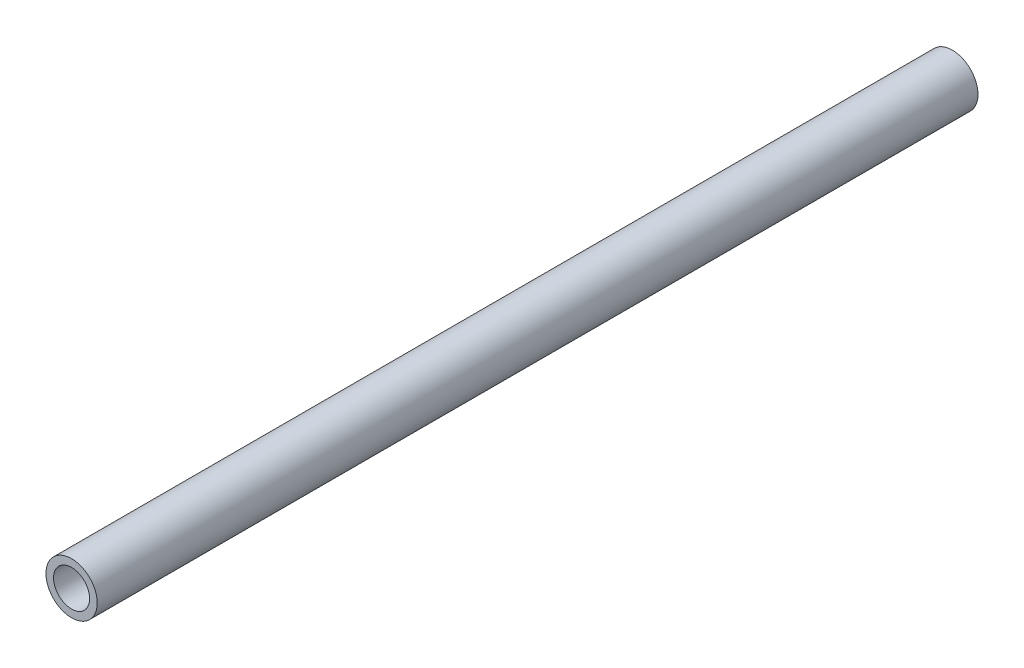
ISO-10303-21;
HEADER;
FILE_DESCRIPTION(('STEP AP214'),'2;1');
FILE_NAME('part.step','',(''),(''),'','','');
FILE_SCHEMA(('AUTOMOTIVE_DESIGN { 1 0 10303 214 1 1 1 1 }'));
ENDSEC;
DATA;
#1=APPLICATION_CONTEXT('core data for automotive mechanical design processes');
#2=APPLICATION_PROTOCOL_DEFINITION('international standard','automotive_design',2000,#1);
#3=PRODUCT_CONTEXT('',#1,'mechanical');
#4=PRODUCT('Part','Part','',(#3));
#5=PRODUCT_RELATED_PRODUCT_CATEGORY('part','',(#4));
#6=PRODUCT_DEFINITION_FORMATION('','',#4);
#7=PRODUCT_DEFINITION_CONTEXT('part definition',#1,'design');
#8=PRODUCT_DEFINITION('design','',#6,#7);
#9=PRODUCT_DEFINITION_SHAPE('','',#8);
#10=(LENGTH_UNIT() NAMED_UNIT(*) SI_UNIT(.MILLI.,.METRE.));
#11=(NAMED_UNIT(*) PLANE_ANGLE_UNIT() SI_UNIT($,.RADIAN.));
#12=(NAMED_UNIT(*) SI_UNIT($,.STERADIAN.) SOLID_ANGLE_UNIT());
#13=UNCERTAINTY_MEASURE_WITH_UNIT(LENGTH_MEASURE(1.E-05),#10,'distance_accuracy_value','');
#14=(GEOMETRIC_REPRESENTATION_CONTEXT(3) GLOBAL_UNCERTAINTY_ASSIGNED_CONTEXT((#13)) GLOBAL_UNIT_ASSIGNED_CONTEXT((#10,
#11,#12)) REPRESENTATION_CONTEXT('',''));
#15=CARTESIAN_POINT('',(0.,0.,0.));
#16=DIRECTION('',(0.,0.,1.));
#17=DIRECTION('',(1.,0.,0.));
#18=AXIS2_PLACEMENT_3D('',#15,#16,#17);
#19=CARTESIAN_POINT('',(351.5,-19.,502.183766184074));
#20=DIRECTION('',(0.,0.,-1.));
#21=DIRECTION('',(-1.,0.,0.));
#22=AXIS2_PLACEMENT_3D('',#19,#20,#21);
#23=CYLINDRICAL_SURFACE('',#22,13.5);
#24=CARTESIAN_POINT('',(351.5,-19.,0.));
#25=DIRECTION('',(0.,0.,1.));
#26=DIRECTION('',(1.,0.,0.));
#27=AXIS2_PLACEMENT_3D('',#24,#25,#26);
#28=CIRCLE('',#27,13.5);
#29=CARTESIAN_POINT('',(365.,-19.,0.));
#30=VERTEX_POINT('',#29);
#31=EDGE_CURVE('E47',#30,#30,#28,.T.);
#32=ORIENTED_EDGE('',*,*,#31,.T.);
#33=EDGE_LOOP('',(#32));
#34=FACE_BOUND('',#33,.T.);
#35=CARTESIAN_POINT('',(351.5,-19.,464.));
#36=DIRECTION('',(0.,0.,1.));
#37=DIRECTION('',(1.,0.,0.));
#38=AXIS2_PLACEMENT_3D('',#35,#36,#37);
#39=CIRCLE('',#38,13.5);
#40=CARTESIAN_POINT('',(365.,-19.,464.));
#41=VERTEX_POINT('',#40);
#42=EDGE_CURVE('E10',#41,#41,#39,.T.);
#43=ORIENTED_EDGE('',*,*,#42,.F.);
#44=EDGE_LOOP('',(#43));
#45=FACE_BOUND('',#44,.T.);
#46=ADVANCED_FACE('F34',(#34,#45),#23,.T.);
#47=CARTESIAN_POINT('',(351.5,-19.,0.));
#48=DIRECTION('',(0.,0.,1.));
#49=DIRECTION('',(1.,0.,0.));
#50=AXIS2_PLACEMENT_3D('',#47,#48,#49);
#51=PLANE('',#50);
#52=ORIENTED_EDGE('',*,*,#31,.F.);
#53=EDGE_LOOP('',(#52));
#54=FACE_BOUND('',#53,.T.);
#55=CARTESIAN_POINT('',(351.5,-19.,0.));
#56=DIRECTION('',(0.,0.,1.));
#57=DIRECTION('',(1.,0.,0.));
#58=AXIS2_PLACEMENT_3D('',#55,#56,#57);
#59=CIRCLE('',#58,9.50000000000001);
#60=CARTESIAN_POINT('',(361.,-19.,0.));
#61=VERTEX_POINT('',#60);
#62=EDGE_CURVE('E49',#61,#61,#59,.T.);
#63=ORIENTED_EDGE('',*,*,#62,.T.);
#64=EDGE_LOOP('',(#63));
#65=FACE_BOUND('',#64,.T.);
#66=ADVANCED_FACE('F58',(#54,#65),#51,.F.);
#67=CARTESIAN_POINT('',(351.5,-19.,502.183766184074));
#68=DIRECTION('',(0.,0.,-1.));
#69=DIRECTION('',(-1.,0.,0.));
#70=AXIS2_PLACEMENT_3D('',#67,#68,#69);
#71=CYLINDRICAL_SURFACE('',#70,9.50000000000001);
#72=ORIENTED_EDGE('',*,*,#62,.F.);
#73=EDGE_LOOP('',(#72));
#74=FACE_BOUND('',#73,.T.);
#75=CARTESIAN_POINT('',(351.5,-19.,464.));
#76=DIRECTION('',(0.,0.,1.));
#77=DIRECTION('',(1.,0.,0.));
#78=AXIS2_PLACEMENT_3D('',#75,#76,#77);
#79=CIRCLE('',#78,9.50000000000001);
#80=CARTESIAN_POINT('',(361.,-19.,464.));
#81=VERTEX_POINT('',#80);
#82=EDGE_CURVE('E37',#81,#81,#79,.T.);
#83=ORIENTED_EDGE('',*,*,#82,.T.);
#84=EDGE_LOOP('',(#83));
#85=FACE_BOUND('',#84,.T.);
#86=ADVANCED_FACE('F61',(#74,#85),#71,.F.);
#87=CARTESIAN_POINT('',(0.,-38.,464.));
#88=DIRECTION('',(0.,0.,1.));
#89=DIRECTION('',(-1.,0.,0.));
#90=AXIS2_PLACEMENT_3D('',#87,#88,#89);
#91=PLANE('',#90);
#92=ORIENTED_EDGE('',*,*,#82,.F.);
#93=EDGE_LOOP('',(#92));
#94=FACE_BOUND('',#93,.T.);
#95=ORIENTED_EDGE('',*,*,#42,.T.);
#96=EDGE_LOOP('',(#95));
#97=FACE_BOUND('',#96,.T.);
#98=ADVANCED_FACE('F66',(#94,#97),#91,.T.);
#99=CLOSED_SHELL('',(#46,#66,#86,#98));
#100=MANIFOLD_SOLID_BREP('B2',#99);
#101=ADVANCED_BREP_SHAPE_REPRESENTATION('',(#18,#100),#14);
#102=SHAPE_DEFINITION_REPRESENTATION(#9,#101);
ENDSEC;
END-ISO-10303-21;
